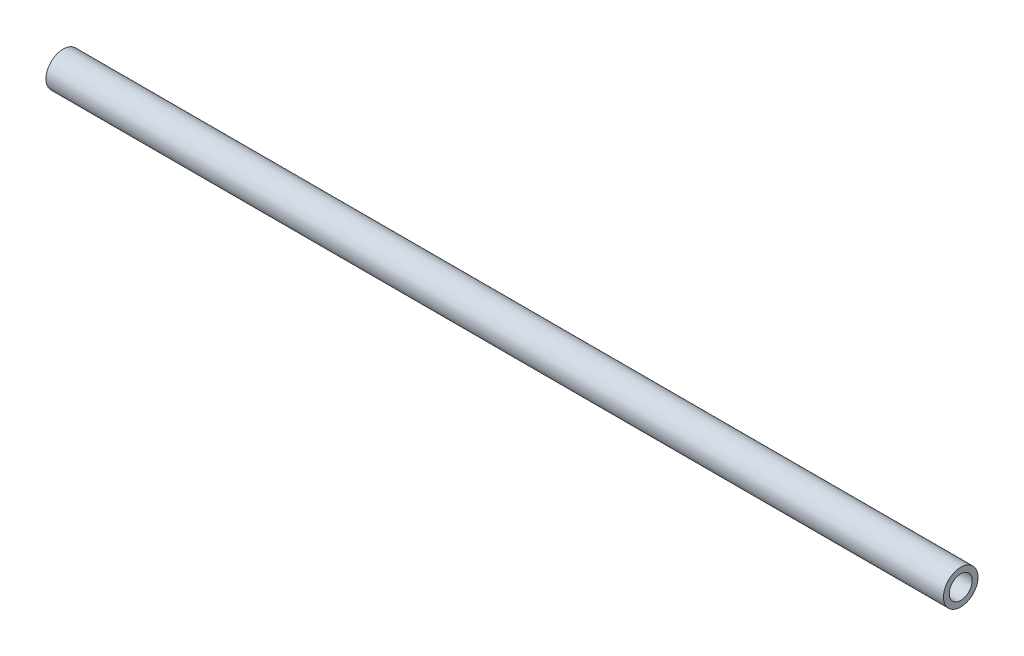
ISO-10303-21;
HEADER;
FILE_DESCRIPTION(('STEP AP214'),'2;1');
FILE_NAME('part.step','',(''),(''),'','','');
FILE_SCHEMA(('AUTOMOTIVE_DESIGN { 1 0 10303 214 1 1 1 1 }'));
ENDSEC;
DATA;
#1=APPLICATION_CONTEXT('core data for automotive mechanical design processes');
#2=APPLICATION_PROTOCOL_DEFINITION('international standard','automotive_design',2000,#1);
#3=PRODUCT_CONTEXT('',#1,'mechanical');
#4=PRODUCT('Part','Part','',(#3));
#5=PRODUCT_RELATED_PRODUCT_CATEGORY('part','',(#4));
#6=PRODUCT_DEFINITION_FORMATION('','',#4);
#7=PRODUCT_DEFINITION_CONTEXT('part definition',#1,'design');
#8=PRODUCT_DEFINITION('design','',#6,#7);
#9=PRODUCT_DEFINITION_SHAPE('','',#8);
#10=(LENGTH_UNIT() NAMED_UNIT(*) SI_UNIT(.MILLI.,.METRE.));
#11=(NAMED_UNIT(*) PLANE_ANGLE_UNIT() SI_UNIT($,.RADIAN.));
#12=(NAMED_UNIT(*) SI_UNIT($,.STERADIAN.) SOLID_ANGLE_UNIT());
#13=UNCERTAINTY_MEASURE_WITH_UNIT(LENGTH_MEASURE(1.E-05),#10,'distance_accuracy_value','');
#14=(GEOMETRIC_REPRESENTATION_CONTEXT(3) GLOBAL_UNCERTAINTY_ASSIGNED_CONTEXT((#13)) GLOBAL_UNIT_ASSIGNED_CONTEXT((#10,
#11,#12)) REPRESENTATION_CONTEXT('',''));
#15=CARTESIAN_POINT('',(0.,0.,0.));
#16=DIRECTION('',(0.,0.,1.));
#17=DIRECTION('',(1.,0.,0.));
#18=AXIS2_PLACEMENT_3D('',#15,#16,#17);
#19=CARTESIAN_POINT('',(-495.3,0.,0.));
#20=DIRECTION('',(1.,0.,0.));
#21=DIRECTION('',(0.,0.,-1.));
#22=AXIS2_PLACEMENT_3D('',#19,#20,#21);
#23=CYLINDRICAL_SURFACE('',#22,6.35);
#24=CARTESIAN_POINT('',(-495.3,0.,0.));
#25=DIRECTION('',(1.,0.,0.));
#26=DIRECTION('',(0.,0.,-1.));
#27=AXIS2_PLACEMENT_3D('',#24,#25,#26);
#28=CIRCLE('',#27,6.35);
#29=CARTESIAN_POINT('',(-495.3,0.,-6.35));
#30=VERTEX_POINT('',#29);
#31=EDGE_CURVE('E45',#30,#30,#28,.T.);
#32=ORIENTED_EDGE('',*,*,#31,.F.);
#33=EDGE_LOOP('',(#32));
#34=FACE_BOUND('',#33,.T.);
#35=CARTESIAN_POINT('',(0.,0.,0.));
#36=DIRECTION('',(1.,0.,0.));
#37=DIRECTION('',(0.,0.,-1.));
#38=AXIS2_PLACEMENT_3D('',#35,#36,#37);
#39=CIRCLE('',#38,6.35);
#40=CARTESIAN_POINT('',(0.,0.,-6.35));
#41=VERTEX_POINT('',#40);
#42=EDGE_CURVE('E52',#41,#41,#39,.T.);
#43=ORIENTED_EDGE('',*,*,#42,.T.);
#44=EDGE_LOOP('',(#43));
#45=FACE_BOUND('',#44,.T.);
#46=ADVANCED_FACE('F37',(#34,#45),#23,.F.);
#47=CARTESIAN_POINT('',(-495.3,0.,0.));
#48=DIRECTION('',(1.,0.,0.));
#49=DIRECTION('',(0.,0.,-1.));
#50=AXIS2_PLACEMENT_3D('',#47,#48,#49);
#51=CYLINDRICAL_SURFACE('',#50,9.525);
#52=CARTESIAN_POINT('',(-495.3,0.,0.));
#53=DIRECTION('',(1.,0.,0.));
#54=DIRECTION('',(0.,0.,-1.));
#55=AXIS2_PLACEMENT_3D('',#52,#53,#54);
#56=CIRCLE('',#55,9.525);
#57=CARTESIAN_POINT('',(-495.3,0.,-9.525));
#58=VERTEX_POINT('',#57);
#59=EDGE_CURVE('E10',#58,#58,#56,.T.);
#60=ORIENTED_EDGE('',*,*,#59,.T.);
#61=EDGE_LOOP('',(#60));
#62=FACE_BOUND('',#61,.T.);
#63=CARTESIAN_POINT('',(0.,0.,0.));
#64=DIRECTION('',(1.,0.,0.));
#65=DIRECTION('',(0.,0.,-1.));
#66=AXIS2_PLACEMENT_3D('',#63,#64,#65);
#67=CIRCLE('',#66,9.525);
#68=CARTESIAN_POINT('',(0.,0.,-9.525));
#69=VERTEX_POINT('',#68);
#70=EDGE_CURVE('E40',#69,#69,#67,.T.);
#71=ORIENTED_EDGE('',*,*,#70,.F.);
#72=EDGE_LOOP('',(#71));
#73=FACE_BOUND('',#72,.T.);
#74=ADVANCED_FACE('F63',(#62,#73),#51,.T.);
#75=CARTESIAN_POINT('',(-495.3,0.,0.));
#76=DIRECTION('',(1.,0.,0.));
#77=DIRECTION('',(0.,0.,-1.));
#78=AXIS2_PLACEMENT_3D('',#75,#76,#77);
#79=PLANE('',#78);
#80=ORIENTED_EDGE('',*,*,#31,.T.);
#81=EDGE_LOOP('',(#80));
#82=FACE_BOUND('',#81,.T.);
#83=ORIENTED_EDGE('',*,*,#59,.F.);
#84=EDGE_LOOP('',(#83));
#85=FACE_BOUND('',#84,.T.);
#86=ADVANCED_FACE('F65',(#82,#85),#79,.F.);
#87=CARTESIAN_POINT('',(0.,0.,0.));
#88=DIRECTION('',(1.,0.,0.));
#89=DIRECTION('',(0.,0.,-1.));
#90=AXIS2_PLACEMENT_3D('',#87,#88,#89);
#91=PLANE('',#90);
#92=ORIENTED_EDGE('',*,*,#42,.F.);
#93=EDGE_LOOP('',(#92));
#94=FACE_BOUND('',#93,.T.);
#95=ORIENTED_EDGE('',*,*,#70,.T.);
#96=EDGE_LOOP('',(#95));
#97=FACE_BOUND('',#96,.T.);
#98=ADVANCED_FACE('F61',(#94,#97),#91,.T.);
#99=CLOSED_SHELL('',(#46,#74,#86,#98));
#100=MANIFOLD_SOLID_BREP('B2',#99);
#101=ADVANCED_BREP_SHAPE_REPRESENTATION('',(#18,#100),#14);
#102=SHAPE_DEFINITION_REPRESENTATION(#9,#101);
ENDSEC;
END-ISO-10303-21;
